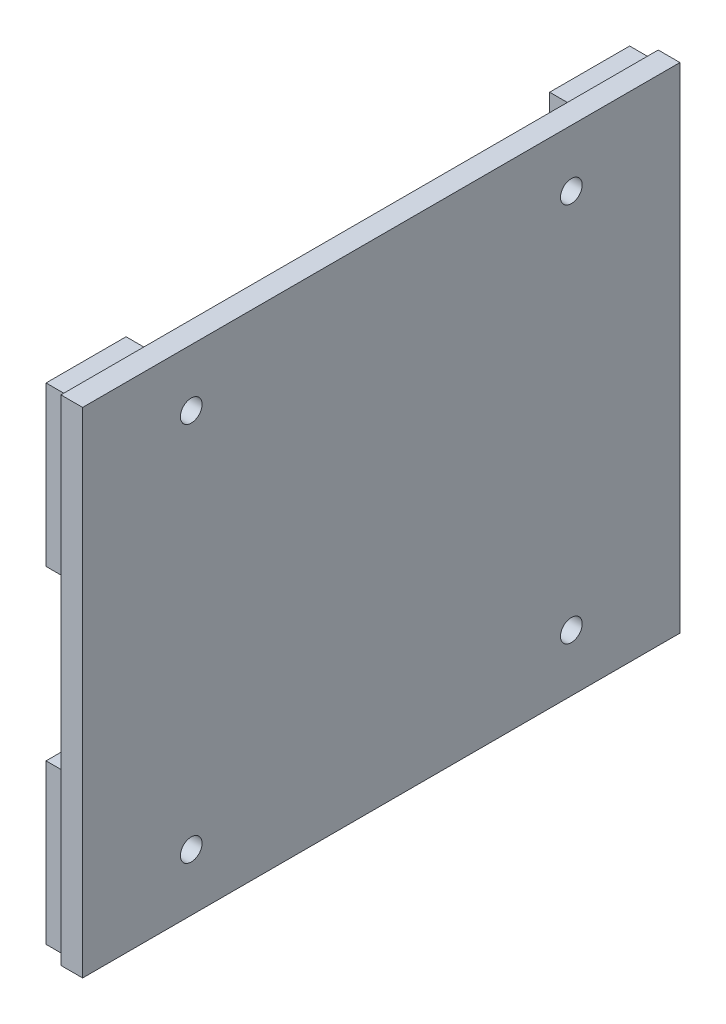
ISO-10303-21;
HEADER;
FILE_DESCRIPTION(('STEP AP214'),'2;1');
FILE_NAME('part.step','',(''),(''),'','','');
FILE_SCHEMA(('AUTOMOTIVE_DESIGN { 1 0 10303 214 1 1 1 1 }'));
ENDSEC;
DATA;
#1=APPLICATION_CONTEXT('core data for automotive mechanical design processes');
#2=APPLICATION_PROTOCOL_DEFINITION('international standard','automotive_design',2000,#1);
#3=PRODUCT_CONTEXT('',#1,'mechanical');
#4=PRODUCT('Part','Part','',(#3));
#5=PRODUCT_RELATED_PRODUCT_CATEGORY('part','',(#4));
#6=PRODUCT_DEFINITION_FORMATION('','',#4);
#7=PRODUCT_DEFINITION_CONTEXT('part definition',#1,'design');
#8=PRODUCT_DEFINITION('design','',#6,#7);
#9=PRODUCT_DEFINITION_SHAPE('','',#8);
#10=(LENGTH_UNIT() NAMED_UNIT(*) SI_UNIT(.MILLI.,.METRE.));
#11=(NAMED_UNIT(*) PLANE_ANGLE_UNIT() SI_UNIT($,.RADIAN.));
#12=(NAMED_UNIT(*) SI_UNIT($,.STERADIAN.) SOLID_ANGLE_UNIT());
#13=UNCERTAINTY_MEASURE_WITH_UNIT(LENGTH_MEASURE(1.E-05),#10,'distance_accuracy_value','');
#14=(GEOMETRIC_REPRESENTATION_CONTEXT(3) GLOBAL_UNCERTAINTY_ASSIGNED_CONTEXT((#13)) GLOBAL_UNIT_ASSIGNED_CONTEXT((#10,
#11,#12)) REPRESENTATION_CONTEXT('',''));
#15=CARTESIAN_POINT('',(0.,0.,0.));
#16=DIRECTION('',(0.,0.,1.));
#17=DIRECTION('',(1.,0.,0.));
#18=AXIS2_PLACEMENT_3D('',#15,#16,#17);
#19=CARTESIAN_POINT('',(0.,0.,0.));
#20=DIRECTION('',(-1.,0.,0.));
#21=DIRECTION('',(0.,0.,1.));
#22=AXIS2_PLACEMENT_3D('',#19,#20,#21);
#23=PLANE('',#22);
#24=CARTESIAN_POINT('',(0.,-55.5625,-55.5625));
#25=DIRECTION('',(1.,0.,0.));
#26=DIRECTION('',(0.,0.,-1.));
#27=AXIS2_PLACEMENT_3D('',#24,#25,#26);
#28=CIRCLE('',#27,3.175);
#29=CARTESIAN_POINT('',(0.,-55.5625,-58.7375));
#30=VERTEX_POINT('',#29);
#31=EDGE_CURVE('E293',#30,#30,#28,.T.);
#32=ORIENTED_EDGE('',*,*,#31,.T.);
#33=EDGE_LOOP('',(#32));
#34=FACE_BOUND('',#33,.T.);
#35=CARTESIAN_POINT('',(0.,55.5625,55.5625));
#36=DIRECTION('',(1.,0.,0.));
#37=DIRECTION('',(0.,0.,-1.));
#38=AXIS2_PLACEMENT_3D('',#35,#36,#37);
#39=CIRCLE('',#38,3.175);
#40=CARTESIAN_POINT('',(0.,55.5625,52.3875));
#41=VERTEX_POINT('',#40);
#42=EDGE_CURVE('E305',#41,#41,#39,.T.);
#43=ORIENTED_EDGE('',*,*,#42,.T.);
#44=EDGE_LOOP('',(#43));
#45=FACE_BOUND('',#44,.T.);
#46=DIRECTION('',(0.,1.,0.));
#47=VECTOR('',#46,1.);
#48=CARTESIAN_POINT('',(0.,-72.23125,-87.3125));
#49=LINE('',#48,#47);
#50=CARTESIAN_POINT('',(0.,-72.23125,-87.3125));
#51=VERTEX_POINT('',#50);
#52=CARTESIAN_POINT('',(0.,72.23125,-87.3125));
#53=VERTEX_POINT('',#52);
#54=EDGE_CURVE('E311',#51,#53,#49,.T.);
#55=ORIENTED_EDGE('',*,*,#54,.F.);
#56=DIRECTION('',(0.,0.,-1.));
#57=VECTOR('',#56,1.);
#58=CARTESIAN_POINT('',(0.,-72.23125,87.3125));
#59=LINE('',#58,#57);
#60=CARTESIAN_POINT('',(0.,-72.23125,87.3125));
#61=VERTEX_POINT('',#60);
#62=EDGE_CURVE('E318',#61,#51,#59,.T.);
#63=ORIENTED_EDGE('',*,*,#62,.F.);
#64=DIRECTION('',(0.,-1.,0.));
#65=VECTOR('',#64,1.);
#66=CARTESIAN_POINT('',(0.,-72.23125,87.3125));
#67=LINE('',#66,#65);
#68=CARTESIAN_POINT('',(0.,72.23125,87.3125));
#69=VERTEX_POINT('',#68);
#70=EDGE_CURVE('E329',#69,#61,#67,.T.);
#71=ORIENTED_EDGE('',*,*,#70,.F.);
#72=DIRECTION('',(0.,0.,1.));
#73=VECTOR('',#72,1.);
#74=CARTESIAN_POINT('',(0.,72.23125,87.3125));
#75=LINE('',#74,#73);
#76=EDGE_CURVE('E327',#53,#69,#75,.T.);
#77=ORIENTED_EDGE('',*,*,#76,.F.);
#78=EDGE_LOOP('',(#55,#63,#71,#77));
#79=FACE_BOUND('',#78,.T.);
#80=CARTESIAN_POINT('',(0.,55.5625,-55.5625));
#81=DIRECTION('',(1.,0.,0.));
#82=DIRECTION('',(0.,0.,-1.));
#83=AXIS2_PLACEMENT_3D('',#80,#81,#82);
#84=CIRCLE('',#83,3.17499999999999);
#85=CARTESIAN_POINT('',(0.,55.5625,-58.7375));
#86=VERTEX_POINT('',#85);
#87=EDGE_CURVE('E299',#86,#86,#84,.T.);
#88=ORIENTED_EDGE('',*,*,#87,.T.);
#89=EDGE_LOOP('',(#88));
#90=FACE_BOUND('',#89,.T.);
#91=CARTESIAN_POINT('',(0.,-55.5625,55.5625));
#92=DIRECTION('',(1.,0.,0.));
#93=DIRECTION('',(0.,0.,-1.));
#94=AXIS2_PLACEMENT_3D('',#91,#92,#93);
#95=CIRCLE('',#94,3.175);
#96=CARTESIAN_POINT('',(0.,-55.5625,52.3875));
#97=VERTEX_POINT('',#96);
#98=EDGE_CURVE('E289',#97,#97,#95,.T.);
#99=ORIENTED_EDGE('',*,*,#98,.T.);
#100=EDGE_LOOP('',(#99));
#101=FACE_BOUND('',#100,.T.);
#102=DIRECTION('',(0.,0.,1.));
#103=VECTOR('',#102,1.);
#104=CARTESIAN_POINT('',(0.,24.60625,85.3069188779781));
#105=LINE('',#104,#103);
#106=CARTESIAN_POINT('',(0.,24.60625,61.9125));
#107=VERTEX_POINT('',#106);
#108=CARTESIAN_POINT('',(0.,24.60625,85.3069188779781));
#109=VERTEX_POINT('',#108);
#110=EDGE_CURVE('E274',#107,#109,#105,.T.);
#111=ORIENTED_EDGE('',*,*,#110,.F.);
#112=DIRECTION('',(0.,-1.,0.));
#113=VECTOR('',#112,1.);
#114=CARTESIAN_POINT('',(0.,71.069393602546,61.9125));
#115=LINE('',#114,#113);
#116=CARTESIAN_POINT('',(0.,71.069393602546,61.9125));
#117=VERTEX_POINT('',#116);
#118=EDGE_CURVE('E260',#117,#107,#115,.T.);
#119=ORIENTED_EDGE('',*,*,#118,.F.);
#120=DIRECTION('',(0.,0.,-1.));
#121=VECTOR('',#120,1.);
#122=CARTESIAN_POINT('',(0.,71.069393602546,61.9125));
#123=LINE('',#122,#121);
#124=CARTESIAN_POINT('',(0.,71.069393602546,85.3069188779781));
#125=VERTEX_POINT('',#124);
#126=EDGE_CURVE('E265',#125,#117,#123,.T.);
#127=ORIENTED_EDGE('',*,*,#126,.F.);
#128=DIRECTION('',(0.,1.,0.));
#129=VECTOR('',#128,1.);
#130=CARTESIAN_POINT('',(0.,24.60625,85.3069188779781));
#131=LINE('',#130,#129);
#132=EDGE_CURVE('E276',#109,#125,#131,.T.);
#133=ORIENTED_EDGE('',*,*,#132,.F.);
#134=EDGE_LOOP('',(#111,#119,#127,#133));
#135=FACE_BOUND('',#134,.T.);
#136=DIRECTION('',(0.,1.,0.));
#137=VECTOR('',#136,1.);
#138=CARTESIAN_POINT('',(0.,71.069393602546,-61.9125));
#139=LINE('',#138,#137);
#140=CARTESIAN_POINT('',(0.,24.60625,-61.9125));
#141=VERTEX_POINT('',#140);
#142=CARTESIAN_POINT('',(0.,71.069393602546,-61.9125));
#143=VERTEX_POINT('',#142);
#144=EDGE_CURVE('E245',#141,#143,#139,.T.);
#145=ORIENTED_EDGE('',*,*,#144,.F.);
#146=DIRECTION('',(0.,0.,1.));
#147=VECTOR('',#146,1.);
#148=CARTESIAN_POINT('',(0.,24.60625,-85.3069188779781));
#149=LINE('',#148,#147);
#150=CARTESIAN_POINT('',(0.,24.60625,-85.3069188779781));
#151=VERTEX_POINT('',#150);
#152=EDGE_CURVE('E231',#151,#141,#149,.T.);
#153=ORIENTED_EDGE('',*,*,#152,.F.);
#154=DIRECTION('',(0.,-1.,0.));
#155=VECTOR('',#154,1.);
#156=CARTESIAN_POINT('',(0.,24.60625,-85.3069188779781));
#157=LINE('',#156,#155);
#158=CARTESIAN_POINT('',(0.,71.069393602546,-85.3069188779781));
#159=VERTEX_POINT('',#158);
#160=EDGE_CURVE('E236',#159,#151,#157,.T.);
#161=ORIENTED_EDGE('',*,*,#160,.F.);
#162=DIRECTION('',(0.,0.,-1.));
#163=VECTOR('',#162,1.);
#164=CARTESIAN_POINT('',(0.,71.069393602546,-61.9125));
#165=LINE('',#164,#163);
#166=EDGE_CURVE('E247',#143,#159,#165,.T.);
#167=ORIENTED_EDGE('',*,*,#166,.F.);
#168=EDGE_LOOP('',(#145,#153,#161,#167));
#169=FACE_BOUND('',#168,.T.);
#170=DIRECTION('',(0.,0.,1.));
#171=VECTOR('',#170,1.);
#172=CARTESIAN_POINT('',(0.,-71.069393602546,-61.9125));
#173=LINE('',#172,#171);
#174=CARTESIAN_POINT('',(0.,-71.069393602546,-85.3069188779781));
#175=VERTEX_POINT('',#174);
#176=CARTESIAN_POINT('',(0.,-71.069393602546,-61.9125));
#177=VERTEX_POINT('',#176);
#178=EDGE_CURVE('E203',#175,#177,#173,.T.);
#179=ORIENTED_EDGE('',*,*,#178,.F.);
#180=DIRECTION('',(0.,-1.,0.));
#181=VECTOR('',#180,1.);
#182=CARTESIAN_POINT('',(0.,-24.60625,-85.3069188779781));
#183=LINE('',#182,#181);
#184=CARTESIAN_POINT('',(0.,-24.60625,-85.3069188779781));
#185=VERTEX_POINT('',#184);
#186=EDGE_CURVE('E200',#185,#175,#183,.T.);
#187=ORIENTED_EDGE('',*,*,#186,.F.);
#188=DIRECTION('',(0.,0.,-1.));
#189=VECTOR('',#188,1.);
#190=CARTESIAN_POINT('',(0.,-24.60625,-85.3069188779781));
#191=LINE('',#190,#189);
#192=CARTESIAN_POINT('',(0.,-24.60625,-61.9125));
#193=VERTEX_POINT('',#192);
#194=EDGE_CURVE('E212',#193,#185,#191,.T.);
#195=ORIENTED_EDGE('',*,*,#194,.F.);
#196=DIRECTION('',(0.,1.,0.));
#197=VECTOR('',#196,1.);
#198=CARTESIAN_POINT('',(0.,-71.069393602546,-61.9125));
#199=LINE('',#198,#197);
#200=EDGE_CURVE('E220',#177,#193,#199,.T.);
#201=ORIENTED_EDGE('',*,*,#200,.F.);
#202=EDGE_LOOP('',(#179,#187,#195,#201));
#203=FACE_BOUND('',#202,.T.);
#204=DIRECTION('',(0.,-1.,0.));
#205=VECTOR('',#204,1.);
#206=CARTESIAN_POINT('',(0.,-71.069393602546,61.9125));
#207=LINE('',#206,#205);
#208=CARTESIAN_POINT('',(0.,-24.60625,61.9125));
#209=VERTEX_POINT('',#208);
#210=CARTESIAN_POINT('',(0.,-71.069393602546,61.9125));
#211=VERTEX_POINT('',#210);
#212=EDGE_CURVE('E647',#209,#211,#207,.T.);
#213=ORIENTED_EDGE('',*,*,#212,.F.);
#214=DIRECTION('',(0.,0.,-1.));
#215=VECTOR('',#214,1.);
#216=CARTESIAN_POINT('',(0.,-24.60625,85.3069188779781));
#217=LINE('',#216,#215);
#218=CARTESIAN_POINT('',(0.,-24.60625,85.3069188779781));
#219=VERTEX_POINT('',#218);
#220=EDGE_CURVE('E198',#219,#209,#217,.T.);
#221=ORIENTED_EDGE('',*,*,#220,.F.);
#222=DIRECTION('',(0.,1.,0.));
#223=VECTOR('',#222,1.);
#224=CARTESIAN_POINT('',(0.,-24.60625,85.3069188779781));
#225=LINE('',#224,#223);
#226=CARTESIAN_POINT('',(0.,-71.069393602546,85.3069188779781));
#227=VERTEX_POINT('',#226);
#228=EDGE_CURVE('E194',#227,#219,#225,.T.);
#229=ORIENTED_EDGE('',*,*,#228,.F.);
#230=DIRECTION('',(0.,0.,1.));
#231=VECTOR('',#230,1.);
#232=CARTESIAN_POINT('',(0.,-71.069393602546,61.9125));
#233=LINE('',#232,#231);
#234=EDGE_CURVE('E644',#211,#227,#233,.T.);
#235=ORIENTED_EDGE('',*,*,#234,.F.);
#236=EDGE_LOOP('',(#213,#221,#229,#235));
#237=FACE_BOUND('',#236,.T.);
#238=ADVANCED_FACE('F37',(#34,#45,#79,#90,#101,#135,#169,#203,#237),#23,.T.);
#239=CARTESIAN_POINT('',(6.35,0.,0.));
#240=DIRECTION('',(-1.,0.,0.));
#241=DIRECTION('',(0.,0.,1.));
#242=AXIS2_PLACEMENT_3D('',#239,#240,#241);
#243=PLANE('',#242);
#244=DIRECTION('',(0.,1.,0.));
#245=VECTOR('',#244,1.);
#246=CARTESIAN_POINT('',(6.35,-72.23125,-87.3125));
#247=LINE('',#246,#245);
#248=CARTESIAN_POINT('',(6.35,-72.23125,-87.3125));
#249=VERTEX_POINT('',#248);
#250=CARTESIAN_POINT('',(6.35,72.23125,-87.3125));
#251=VERTEX_POINT('',#250);
#252=EDGE_CURVE('E314',#249,#251,#247,.T.);
#253=ORIENTED_EDGE('',*,*,#252,.T.);
#254=DIRECTION('',(0.,0.,1.));
#255=VECTOR('',#254,1.);
#256=CARTESIAN_POINT('',(6.35,72.23125,87.3125));
#257=LINE('',#256,#255);
#258=CARTESIAN_POINT('',(6.35,72.23125,87.3125));
#259=VERTEX_POINT('',#258);
#260=EDGE_CURVE('E317',#251,#259,#257,.T.);
#261=ORIENTED_EDGE('',*,*,#260,.T.);
#262=DIRECTION('',(0.,-1.,0.));
#263=VECTOR('',#262,1.);
#264=CARTESIAN_POINT('',(6.35,-72.23125,87.3125));
#265=LINE('',#264,#263);
#266=CARTESIAN_POINT('',(6.35,-72.23125,87.3125));
#267=VERTEX_POINT('',#266);
#268=EDGE_CURVE('E320',#259,#267,#265,.T.);
#269=ORIENTED_EDGE('',*,*,#268,.T.);
#270=DIRECTION('',(0.,0.,-1.));
#271=VECTOR('',#270,1.);
#272=CARTESIAN_POINT('',(6.35,-72.23125,87.3125));
#273=LINE('',#272,#271);
#274=EDGE_CURVE('E322',#267,#249,#273,.T.);
#275=ORIENTED_EDGE('',*,*,#274,.T.);
#276=EDGE_LOOP('',(#253,#261,#269,#275));
#277=FACE_BOUND('',#276,.T.);
#278=CARTESIAN_POINT('',(6.35,55.5625,55.5625));
#279=DIRECTION('',(1.,0.,0.));
#280=DIRECTION('',(0.,0.,-1.));
#281=AXIS2_PLACEMENT_3D('',#278,#279,#280);
#282=CIRCLE('',#281,3.175);
#283=CARTESIAN_POINT('',(6.35,55.5625,52.3875));
#284=VERTEX_POINT('',#283);
#285=EDGE_CURVE('E308',#284,#284,#282,.T.);
#286=ORIENTED_EDGE('',*,*,#285,.F.);
#287=EDGE_LOOP('',(#286));
#288=FACE_BOUND('',#287,.T.);
#289=CARTESIAN_POINT('',(6.35,55.5625,-55.5625));
#290=DIRECTION('',(1.,0.,0.));
#291=DIRECTION('',(0.,0.,-1.));
#292=AXIS2_PLACEMENT_3D('',#289,#290,#291);
#293=CIRCLE('',#292,3.17499999999999);
#294=CARTESIAN_POINT('',(6.35,55.5625,-58.7375));
#295=VERTEX_POINT('',#294);
#296=EDGE_CURVE('E302',#295,#295,#293,.T.);
#297=ORIENTED_EDGE('',*,*,#296,.F.);
#298=EDGE_LOOP('',(#297));
#299=FACE_BOUND('',#298,.T.);
#300=CARTESIAN_POINT('',(6.35,-55.5625,-55.5625));
#301=DIRECTION('',(1.,0.,0.));
#302=DIRECTION('',(0.,0.,-1.));
#303=AXIS2_PLACEMENT_3D('',#300,#301,#302);
#304=CIRCLE('',#303,3.175);
#305=CARTESIAN_POINT('',(6.35,-55.5625,-58.7375));
#306=VERTEX_POINT('',#305);
#307=EDGE_CURVE('E296',#306,#306,#304,.T.);
#308=ORIENTED_EDGE('',*,*,#307,.F.);
#309=EDGE_LOOP('',(#308));
#310=FACE_BOUND('',#309,.T.);
#311=CARTESIAN_POINT('',(6.35,-55.5625,55.5625));
#312=DIRECTION('',(1.,0.,0.));
#313=DIRECTION('',(0.,0.,-1.));
#314=AXIS2_PLACEMENT_3D('',#311,#312,#313);
#315=CIRCLE('',#314,3.175);
#316=CARTESIAN_POINT('',(6.35,-55.5625,52.3875));
#317=VERTEX_POINT('',#316);
#318=EDGE_CURVE('E290',#317,#317,#315,.T.);
#319=ORIENTED_EDGE('',*,*,#318,.F.);
#320=EDGE_LOOP('',(#319));
#321=FACE_BOUND('',#320,.T.);
#322=ADVANCED_FACE('F356',(#277,#288,#299,#310,#321),#243,.F.);
#323=CARTESIAN_POINT('',(6.35,-72.23125,-87.3125));
#324=DIRECTION('',(0.,0.,1.));
#325=DIRECTION('',(1.,0.,0.));
#326=AXIS2_PLACEMENT_3D('',#323,#324,#325);
#327=PLANE('',#326);
#328=ORIENTED_EDGE('',*,*,#54,.T.);
#329=DIRECTION('',(-1.,0.,0.));
#330=VECTOR('',#329,1.);
#331=CARTESIAN_POINT('',(6.35,72.23125,-87.3125));
#332=LINE('',#331,#330);
#333=EDGE_CURVE('E11',#251,#53,#332,.T.);
#334=ORIENTED_EDGE('',*,*,#333,.F.);
#335=ORIENTED_EDGE('',*,*,#252,.F.);
#336=DIRECTION('',(-1.,0.,0.));
#337=VECTOR('',#336,1.);
#338=CARTESIAN_POINT('',(6.35,-72.23125,-87.3125));
#339=LINE('',#338,#337);
#340=EDGE_CURVE('E324',#249,#51,#339,.T.);
#341=ORIENTED_EDGE('',*,*,#340,.T.);
#342=EDGE_LOOP('',(#328,#334,#335,#341));
#343=FACE_BOUND('',#342,.T.);
#344=ADVANCED_FACE('F39',(#343),#327,.F.);
#345=CARTESIAN_POINT('',(6.35,72.23125,87.3125));
#346=DIRECTION('',(0.,-1.,0.));
#347=DIRECTION('',(0.,0.,-1.));
#348=AXIS2_PLACEMENT_3D('',#345,#346,#347);
#349=PLANE('',#348);
#350=ORIENTED_EDGE('',*,*,#76,.T.);
#351=DIRECTION('',(-1.,0.,0.));
#352=VECTOR('',#351,1.);
#353=CARTESIAN_POINT('',(6.35,72.23125,87.3125));
#354=LINE('',#353,#352);
#355=EDGE_CURVE('E45',#259,#69,#354,.T.);
#356=ORIENTED_EDGE('',*,*,#355,.F.);
#357=ORIENTED_EDGE('',*,*,#260,.F.);
#358=ORIENTED_EDGE('',*,*,#333,.T.);
#359=EDGE_LOOP('',(#350,#356,#357,#358));
#360=FACE_BOUND('',#359,.T.);
#361=ADVANCED_FACE('F358',(#360),#349,.F.);
#362=CARTESIAN_POINT('',(6.35,-72.23125,87.3125));
#363=DIRECTION('',(0.,0.,-1.));
#364=DIRECTION('',(-1.,0.,0.));
#365=AXIS2_PLACEMENT_3D('',#362,#363,#364);
#366=PLANE('',#365);
#367=ORIENTED_EDGE('',*,*,#70,.T.);
#368=DIRECTION('',(-1.,0.,0.));
#369=VECTOR('',#368,1.);
#370=CARTESIAN_POINT('',(6.35,-72.23125,87.3125));
#371=LINE('',#370,#369);
#372=EDGE_CURVE('E334',#267,#61,#371,.T.);
#373=ORIENTED_EDGE('',*,*,#372,.F.);
#374=ORIENTED_EDGE('',*,*,#268,.F.);
#375=ORIENTED_EDGE('',*,*,#355,.T.);
#376=EDGE_LOOP('',(#367,#373,#374,#375));
#377=FACE_BOUND('',#376,.T.);
#378=ADVANCED_FACE('F341',(#377),#366,.F.);
#379=CARTESIAN_POINT('',(6.35,-72.23125,87.3125));
#380=DIRECTION('',(0.,1.,0.));
#381=DIRECTION('',(0.,0.,1.));
#382=AXIS2_PLACEMENT_3D('',#379,#380,#381);
#383=PLANE('',#382);
#384=ORIENTED_EDGE('',*,*,#62,.T.);
#385=ORIENTED_EDGE('',*,*,#340,.F.);
#386=ORIENTED_EDGE('',*,*,#274,.F.);
#387=ORIENTED_EDGE('',*,*,#372,.T.);
#388=EDGE_LOOP('',(#384,#385,#386,#387));
#389=FACE_BOUND('',#388,.T.);
#390=ADVANCED_FACE('F350',(#389),#383,.F.);
#391=CARTESIAN_POINT('',(6.35,55.5625,55.5625));
#392=DIRECTION('',(-1.,0.,0.));
#393=DIRECTION('',(0.,0.,1.));
#394=AXIS2_PLACEMENT_3D('',#391,#392,#393);
#395=CYLINDRICAL_SURFACE('',#394,3.175);
#396=ORIENTED_EDGE('',*,*,#285,.T.);
#397=EDGE_LOOP('',(#396));
#398=FACE_BOUND('',#397,.T.);
#399=ORIENTED_EDGE('',*,*,#42,.F.);
#400=EDGE_LOOP('',(#399));
#401=FACE_BOUND('',#400,.T.);
#402=ADVANCED_FACE('F376',(#398,#401),#395,.F.);
#403=CARTESIAN_POINT('',(6.35,55.5625,-55.5625));
#404=DIRECTION('',(-1.,0.,0.));
#405=DIRECTION('',(0.,0.,1.));
#406=AXIS2_PLACEMENT_3D('',#403,#404,#405);
#407=CYLINDRICAL_SURFACE('',#406,3.17499999999999);
#408=ORIENTED_EDGE('',*,*,#296,.T.);
#409=EDGE_LOOP('',(#408));
#410=FACE_BOUND('',#409,.T.);
#411=ORIENTED_EDGE('',*,*,#87,.F.);
#412=EDGE_LOOP('',(#411));
#413=FACE_BOUND('',#412,.T.);
#414=ADVANCED_FACE('F380',(#410,#413),#407,.F.);
#415=CARTESIAN_POINT('',(6.35,-55.5625,-55.5625));
#416=DIRECTION('',(-1.,0.,0.));
#417=DIRECTION('',(0.,0.,1.));
#418=AXIS2_PLACEMENT_3D('',#415,#416,#417);
#419=CYLINDRICAL_SURFACE('',#418,3.175);
#420=ORIENTED_EDGE('',*,*,#307,.T.);
#421=EDGE_LOOP('',(#420));
#422=FACE_BOUND('',#421,.T.);
#423=ORIENTED_EDGE('',*,*,#31,.F.);
#424=EDGE_LOOP('',(#423));
#425=FACE_BOUND('',#424,.T.);
#426=ADVANCED_FACE('F385',(#422,#425),#419,.F.);
#427=CARTESIAN_POINT('',(6.35,-55.5625,55.5625));
#428=DIRECTION('',(-1.,0.,0.));
#429=DIRECTION('',(0.,0.,1.));
#430=AXIS2_PLACEMENT_3D('',#427,#428,#429);
#431=CYLINDRICAL_SURFACE('',#430,3.175);
#432=ORIENTED_EDGE('',*,*,#318,.T.);
#433=EDGE_LOOP('',(#432));
#434=FACE_BOUND('',#433,.T.);
#435=ORIENTED_EDGE('',*,*,#98,.F.);
#436=EDGE_LOOP('',(#435));
#437=FACE_BOUND('',#436,.T.);
#438=ADVANCED_FACE('F392',(#434,#437),#431,.F.);
#439=CARTESIAN_POINT('',(-6.35,71.069393602546,61.9125));
#440=DIRECTION('',(0.,0.,1.));
#441=DIRECTION('',(1.,0.,0.));
#442=AXIS2_PLACEMENT_3D('',#439,#440,#441);
#443=PLANE('',#442);
#444=ORIENTED_EDGE('',*,*,#118,.T.);
#445=DIRECTION('',(1.,0.,0.));
#446=VECTOR('',#445,1.);
#447=CARTESIAN_POINT('',(-6.35,24.60625,61.9125));
#448=LINE('',#447,#446);
#449=CARTESIAN_POINT('',(-6.35,24.60625,61.9125));
#450=VERTEX_POINT('',#449);
#451=EDGE_CURVE('E287',#450,#107,#448,.T.);
#452=ORIENTED_EDGE('',*,*,#451,.F.);
#453=DIRECTION('',(0.,-1.,0.));
#454=VECTOR('',#453,1.);
#455=CARTESIAN_POINT('',(-6.35,71.069393602546,61.9125));
#456=LINE('',#455,#454);
#457=CARTESIAN_POINT('',(-6.35,71.069393602546,61.9125));
#458=VERTEX_POINT('',#457);
#459=EDGE_CURVE('E261',#458,#450,#456,.T.);
#460=ORIENTED_EDGE('',*,*,#459,.F.);
#461=DIRECTION('',(1.,0.,0.));
#462=VECTOR('',#461,1.);
#463=CARTESIAN_POINT('',(-6.35,71.069393602546,61.9125));
#464=LINE('',#463,#462);
#465=EDGE_CURVE('E271',#458,#117,#464,.T.);
#466=ORIENTED_EDGE('',*,*,#465,.T.);
#467=EDGE_LOOP('',(#444,#452,#460,#466));
#468=FACE_BOUND('',#467,.T.);
#469=ADVANCED_FACE('F396',(#468),#443,.F.);
#470=CARTESIAN_POINT('',(-6.35,24.60625,85.3069188779781));
#471=DIRECTION('',(0.,1.,0.));
#472=DIRECTION('',(0.,0.,1.));
#473=AXIS2_PLACEMENT_3D('',#470,#471,#472);
#474=PLANE('',#473);
#475=ORIENTED_EDGE('',*,*,#110,.T.);
#476=DIRECTION('',(1.,0.,0.));
#477=VECTOR('',#476,1.);
#478=CARTESIAN_POINT('',(-6.35,24.60625,85.3069188779781));
#479=LINE('',#478,#477);
#480=CARTESIAN_POINT('',(-6.35,24.60625,85.3069188779781));
#481=VERTEX_POINT('',#480);
#482=EDGE_CURVE('E284',#481,#109,#479,.T.);
#483=ORIENTED_EDGE('',*,*,#482,.F.);
#484=DIRECTION('',(0.,0.,1.));
#485=VECTOR('',#484,1.);
#486=CARTESIAN_POINT('',(-6.35,24.60625,85.3069188779781));
#487=LINE('',#486,#485);
#488=EDGE_CURVE('E264',#450,#481,#487,.T.);
#489=ORIENTED_EDGE('',*,*,#488,.F.);
#490=ORIENTED_EDGE('',*,*,#451,.T.);
#491=EDGE_LOOP('',(#475,#483,#489,#490));
#492=FACE_BOUND('',#491,.T.);
#493=ADVANCED_FACE('F400',(#492),#474,.F.);
#494=CARTESIAN_POINT('',(-6.35,24.60625,85.3069188779781));
#495=DIRECTION('',(0.,0.,-1.));
#496=DIRECTION('',(-1.,0.,0.));
#497=AXIS2_PLACEMENT_3D('',#494,#495,#496);
#498=PLANE('',#497);
#499=ORIENTED_EDGE('',*,*,#132,.T.);
#500=DIRECTION('',(1.,0.,0.));
#501=VECTOR('',#500,1.);
#502=CARTESIAN_POINT('',(-6.35,71.069393602546,85.3069188779781));
#503=LINE('',#502,#501);
#504=CARTESIAN_POINT('',(-6.35,71.069393602546,85.3069188779781));
#505=VERTEX_POINT('',#504);
#506=EDGE_CURVE('E282',#505,#125,#503,.T.);
#507=ORIENTED_EDGE('',*,*,#506,.F.);
#508=DIRECTION('',(0.,1.,0.));
#509=VECTOR('',#508,1.);
#510=CARTESIAN_POINT('',(-6.35,24.60625,85.3069188779781));
#511=LINE('',#510,#509);
#512=EDGE_CURVE('E267',#481,#505,#511,.T.);
#513=ORIENTED_EDGE('',*,*,#512,.F.);
#514=ORIENTED_EDGE('',*,*,#482,.T.);
#515=EDGE_LOOP('',(#499,#507,#513,#514));
#516=FACE_BOUND('',#515,.T.);
#517=ADVANCED_FACE('F404',(#516),#498,.F.);
#518=CARTESIAN_POINT('',(-6.35,71.069393602546,61.9125));
#519=DIRECTION('',(0.,-1.,0.));
#520=DIRECTION('',(0.,0.,-1.));
#521=AXIS2_PLACEMENT_3D('',#518,#519,#520);
#522=PLANE('',#521);
#523=ORIENTED_EDGE('',*,*,#126,.T.);
#524=ORIENTED_EDGE('',*,*,#465,.F.);
#525=DIRECTION('',(0.,0.,-1.));
#526=VECTOR('',#525,1.);
#527=CARTESIAN_POINT('',(-6.35,71.069393602546,61.9125));
#528=LINE('',#527,#526);
#529=EDGE_CURVE('E269',#505,#458,#528,.T.);
#530=ORIENTED_EDGE('',*,*,#529,.F.);
#531=ORIENTED_EDGE('',*,*,#506,.T.);
#532=EDGE_LOOP('',(#523,#524,#530,#531));
#533=FACE_BOUND('',#532,.T.);
#534=ADVANCED_FACE('F408',(#533),#522,.F.);
#535=CARTESIAN_POINT('',(-6.35,0.,0.));
#536=DIRECTION('',(1.,0.,0.));
#537=DIRECTION('',(0.,0.,-1.));
#538=AXIS2_PLACEMENT_3D('',#535,#536,#537);
#539=PLANE('',#538);
#540=ORIENTED_EDGE('',*,*,#459,.T.);
#541=ORIENTED_EDGE('',*,*,#488,.T.);
#542=ORIENTED_EDGE('',*,*,#512,.T.);
#543=ORIENTED_EDGE('',*,*,#529,.T.);
#544=EDGE_LOOP('',(#540,#541,#542,#543));
#545=FACE_BOUND('',#544,.T.);
#546=ADVANCED_FACE('F412',(#545),#539,.F.);
#547=CARTESIAN_POINT('',(-6.35,24.60625,-85.3069188779781));
#548=DIRECTION('',(0.,1.,0.));
#549=DIRECTION('',(0.,0.,1.));
#550=AXIS2_PLACEMENT_3D('',#547,#548,#549);
#551=PLANE('',#550);
#552=ORIENTED_EDGE('',*,*,#152,.T.);
#553=DIRECTION('',(1.,0.,0.));
#554=VECTOR('',#553,1.);
#555=CARTESIAN_POINT('',(-6.35,24.60625,-61.9125));
#556=LINE('',#555,#554);
#557=CARTESIAN_POINT('',(-6.35,24.60625,-61.9125));
#558=VERTEX_POINT('',#557);
#559=EDGE_CURVE('E258',#558,#141,#556,.T.);
#560=ORIENTED_EDGE('',*,*,#559,.F.);
#561=DIRECTION('',(0.,0.,1.));
#562=VECTOR('',#561,1.);
#563=CARTESIAN_POINT('',(-6.35,24.60625,-85.3069188779781));
#564=LINE('',#563,#562);
#565=CARTESIAN_POINT('',(-6.35,24.60625,-85.3069188779781));
#566=VERTEX_POINT('',#565);
#567=EDGE_CURVE('E232',#566,#558,#564,.T.);
#568=ORIENTED_EDGE('',*,*,#567,.F.);
#569=DIRECTION('',(1.,0.,0.));
#570=VECTOR('',#569,1.);
#571=CARTESIAN_POINT('',(-6.35,24.60625,-85.3069188779781));
#572=LINE('',#571,#570);
#573=EDGE_CURVE('E242',#566,#151,#572,.T.);
#574=ORIENTED_EDGE('',*,*,#573,.T.);
#575=EDGE_LOOP('',(#552,#560,#568,#574));
#576=FACE_BOUND('',#575,.T.);
#577=ADVANCED_FACE('F416',(#576),#551,.F.);
#578=CARTESIAN_POINT('',(-6.35,71.069393602546,-61.9125));
#579=DIRECTION('',(0.,0.,-1.));
#580=DIRECTION('',(-1.,0.,0.));
#581=AXIS2_PLACEMENT_3D('',#578,#579,#580);
#582=PLANE('',#581);
#583=ORIENTED_EDGE('',*,*,#144,.T.);
#584=DIRECTION('',(1.,0.,0.));
#585=VECTOR('',#584,1.);
#586=CARTESIAN_POINT('',(-6.35,71.069393602546,-61.9125));
#587=LINE('',#586,#585);
#588=CARTESIAN_POINT('',(-6.35,71.069393602546,-61.9125));
#589=VERTEX_POINT('',#588);
#590=EDGE_CURVE('E255',#589,#143,#587,.T.);
#591=ORIENTED_EDGE('',*,*,#590,.F.);
#592=DIRECTION('',(0.,1.,0.));
#593=VECTOR('',#592,1.);
#594=CARTESIAN_POINT('',(-6.35,71.069393602546,-61.9125));
#595=LINE('',#594,#593);
#596=EDGE_CURVE('E235',#558,#589,#595,.T.);
#597=ORIENTED_EDGE('',*,*,#596,.F.);
#598=ORIENTED_EDGE('',*,*,#559,.T.);
#599=EDGE_LOOP('',(#583,#591,#597,#598));
#600=FACE_BOUND('',#599,.T.);
#601=ADVANCED_FACE('F420',(#600),#582,.F.);
#602=CARTESIAN_POINT('',(-6.35,71.069393602546,-61.9125));
#603=DIRECTION('',(0.,-1.,0.));
#604=DIRECTION('',(0.,0.,-1.));
#605=AXIS2_PLACEMENT_3D('',#602,#603,#604);
#606=PLANE('',#605);
#607=ORIENTED_EDGE('',*,*,#166,.T.);
#608=DIRECTION('',(1.,0.,0.));
#609=VECTOR('',#608,1.);
#610=CARTESIAN_POINT('',(-6.35,71.069393602546,-85.3069188779781));
#611=LINE('',#610,#609);
#612=CARTESIAN_POINT('',(-6.35,71.069393602546,-85.3069188779781));
#613=VERTEX_POINT('',#612);
#614=EDGE_CURVE('E253',#613,#159,#611,.T.);
#615=ORIENTED_EDGE('',*,*,#614,.F.);
#616=DIRECTION('',(0.,0.,-1.));
#617=VECTOR('',#616,1.);
#618=CARTESIAN_POINT('',(-6.35,71.069393602546,-61.9125));
#619=LINE('',#618,#617);
#620=EDGE_CURVE('E238',#589,#613,#619,.T.);
#621=ORIENTED_EDGE('',*,*,#620,.F.);
#622=ORIENTED_EDGE('',*,*,#590,.T.);
#623=EDGE_LOOP('',(#607,#615,#621,#622));
#624=FACE_BOUND('',#623,.T.);
#625=ADVANCED_FACE('F424',(#624),#606,.F.);
#626=CARTESIAN_POINT('',(-6.35,24.60625,-85.3069188779781));
#627=DIRECTION('',(0.,0.,1.));
#628=DIRECTION('',(1.,0.,0.));
#629=AXIS2_PLACEMENT_3D('',#626,#627,#628);
#630=PLANE('',#629);
#631=ORIENTED_EDGE('',*,*,#160,.T.);
#632=ORIENTED_EDGE('',*,*,#573,.F.);
#633=DIRECTION('',(0.,-1.,0.));
#634=VECTOR('',#633,1.);
#635=CARTESIAN_POINT('',(-6.35,24.60625,-85.3069188779781));
#636=LINE('',#635,#634);
#637=EDGE_CURVE('E240',#613,#566,#636,.T.);
#638=ORIENTED_EDGE('',*,*,#637,.F.);
#639=ORIENTED_EDGE('',*,*,#614,.T.);
#640=EDGE_LOOP('',(#631,#632,#638,#639));
#641=FACE_BOUND('',#640,.T.);
#642=ADVANCED_FACE('F428',(#641),#630,.F.);
#643=CARTESIAN_POINT('',(-6.35,0.,0.));
#644=DIRECTION('',(1.,0.,0.));
#645=DIRECTION('',(0.,0.,-1.));
#646=AXIS2_PLACEMENT_3D('',#643,#644,#645);
#647=PLANE('',#646);
#648=ORIENTED_EDGE('',*,*,#567,.T.);
#649=ORIENTED_EDGE('',*,*,#596,.T.);
#650=ORIENTED_EDGE('',*,*,#620,.T.);
#651=ORIENTED_EDGE('',*,*,#637,.T.);
#652=EDGE_LOOP('',(#648,#649,#650,#651));
#653=FACE_BOUND('',#652,.T.);
#654=ADVANCED_FACE('F432',(#653),#647,.F.);
#655=CARTESIAN_POINT('',(-6.35,-24.60625,-85.3069188779781));
#656=DIRECTION('',(0.,0.,1.));
#657=DIRECTION('',(1.,0.,0.));
#658=AXIS2_PLACEMENT_3D('',#655,#656,#657);
#659=PLANE('',#658);
#660=ORIENTED_EDGE('',*,*,#186,.T.);
#661=DIRECTION('',(1.,0.,0.));
#662=VECTOR('',#661,1.);
#663=CARTESIAN_POINT('',(-6.35,-71.069393602546,-85.3069188779781));
#664=LINE('',#663,#662);
#665=CARTESIAN_POINT('',(-6.35,-71.069393602546,-85.3069188779781));
#666=VERTEX_POINT('',#665);
#667=EDGE_CURVE('E229',#666,#175,#664,.T.);
#668=ORIENTED_EDGE('',*,*,#667,.F.);
#669=DIRECTION('',(0.,-1.,0.));
#670=VECTOR('',#669,1.);
#671=CARTESIAN_POINT('',(-6.35,-24.60625,-85.3069188779781));
#672=LINE('',#671,#670);
#673=CARTESIAN_POINT('',(-6.35,-24.60625,-85.3069188779781));
#674=VERTEX_POINT('',#673);
#675=EDGE_CURVE('E208',#674,#666,#672,.T.);
#676=ORIENTED_EDGE('',*,*,#675,.F.);
#677=DIRECTION('',(1.,0.,0.));
#678=VECTOR('',#677,1.);
#679=CARTESIAN_POINT('',(-6.35,-24.60625,-85.3069188779781));
#680=LINE('',#679,#678);
#681=EDGE_CURVE('E217',#674,#185,#680,.T.);
#682=ORIENTED_EDGE('',*,*,#681,.T.);
#683=EDGE_LOOP('',(#660,#668,#676,#682));
#684=FACE_BOUND('',#683,.T.);
#685=ADVANCED_FACE('F436',(#684),#659,.F.);
#686=CARTESIAN_POINT('',(-6.35,-71.069393602546,-61.9125));
#687=DIRECTION('',(0.,1.,0.));
#688=DIRECTION('',(0.,0.,1.));
#689=AXIS2_PLACEMENT_3D('',#686,#687,#688);
#690=PLANE('',#689);
#691=ORIENTED_EDGE('',*,*,#178,.T.);
#692=DIRECTION('',(1.,0.,0.));
#693=VECTOR('',#692,1.);
#694=CARTESIAN_POINT('',(-6.35,-71.069393602546,-61.9125));
#695=LINE('',#694,#693);
#696=CARTESIAN_POINT('',(-6.35,-71.069393602546,-61.9125));
#697=VERTEX_POINT('',#696);
#698=EDGE_CURVE('E226',#697,#177,#695,.T.);
#699=ORIENTED_EDGE('',*,*,#698,.F.);
#700=DIRECTION('',(0.,0.,1.));
#701=VECTOR('',#700,1.);
#702=CARTESIAN_POINT('',(-6.35,-71.069393602546,-61.9125));
#703=LINE('',#702,#701);
#704=EDGE_CURVE('E211',#666,#697,#703,.T.);
#705=ORIENTED_EDGE('',*,*,#704,.F.);
#706=ORIENTED_EDGE('',*,*,#667,.T.);
#707=EDGE_LOOP('',(#691,#699,#705,#706));
#708=FACE_BOUND('',#707,.T.);
#709=ADVANCED_FACE('F440',(#708),#690,.F.);
#710=CARTESIAN_POINT('',(-6.35,-71.069393602546,-61.9125));
#711=DIRECTION('',(0.,0.,-1.));
#712=DIRECTION('',(-1.,0.,0.));
#713=AXIS2_PLACEMENT_3D('',#710,#711,#712);
#714=PLANE('',#713);
#715=ORIENTED_EDGE('',*,*,#200,.T.);
#716=DIRECTION('',(1.,0.,0.));
#717=VECTOR('',#716,1.);
#718=CARTESIAN_POINT('',(-6.35,-24.60625,-61.9125));
#719=LINE('',#718,#717);
#720=CARTESIAN_POINT('',(-6.35,-24.60625,-61.9125));
#721=VERTEX_POINT('',#720);
#722=EDGE_CURVE('E60',#721,#193,#719,.T.);
#723=ORIENTED_EDGE('',*,*,#722,.F.);
#724=DIRECTION('',(0.,1.,0.));
#725=VECTOR('',#724,1.);
#726=CARTESIAN_POINT('',(-6.35,-71.069393602546,-61.9125));
#727=LINE('',#726,#725);
#728=EDGE_CURVE('E214',#697,#721,#727,.T.);
#729=ORIENTED_EDGE('',*,*,#728,.F.);
#730=ORIENTED_EDGE('',*,*,#698,.T.);
#731=EDGE_LOOP('',(#715,#723,#729,#730));
#732=FACE_BOUND('',#731,.T.);
#733=ADVANCED_FACE('F444',(#732),#714,.F.);
#734=CARTESIAN_POINT('',(-6.35,-24.60625,-85.3069188779781));
#735=DIRECTION('',(0.,-1.,0.));
#736=DIRECTION('',(0.,0.,-1.));
#737=AXIS2_PLACEMENT_3D('',#734,#735,#736);
#738=PLANE('',#737);
#739=ORIENTED_EDGE('',*,*,#194,.T.);
#740=ORIENTED_EDGE('',*,*,#681,.F.);
#741=DIRECTION('',(0.,0.,-1.));
#742=VECTOR('',#741,1.);
#743=CARTESIAN_POINT('',(-6.35,-24.60625,-85.3069188779781));
#744=LINE('',#743,#742);
#745=EDGE_CURVE('E216',#721,#674,#744,.T.);
#746=ORIENTED_EDGE('',*,*,#745,.F.);
#747=ORIENTED_EDGE('',*,*,#722,.T.);
#748=EDGE_LOOP('',(#739,#740,#746,#747));
#749=FACE_BOUND('',#748,.T.);
#750=ADVANCED_FACE('F448',(#749),#738,.F.);
#751=CARTESIAN_POINT('',(-6.35,0.,0.));
#752=DIRECTION('',(1.,0.,0.));
#753=DIRECTION('',(0.,0.,-1.));
#754=AXIS2_PLACEMENT_3D('',#751,#752,#753);
#755=PLANE('',#754);
#756=ORIENTED_EDGE('',*,*,#675,.T.);
#757=ORIENTED_EDGE('',*,*,#704,.T.);
#758=ORIENTED_EDGE('',*,*,#728,.T.);
#759=ORIENTED_EDGE('',*,*,#745,.T.);
#760=EDGE_LOOP('',(#756,#757,#758,#759));
#761=FACE_BOUND('',#760,.T.);
#762=ADVANCED_FACE('F452',(#761),#755,.F.);
#763=CARTESIAN_POINT('',(-6.35,-24.60625,85.3069188779781));
#764=DIRECTION('',(0.,-1.,0.));
#765=DIRECTION('',(0.,0.,-1.));
#766=AXIS2_PLACEMENT_3D('',#763,#764,#765);
#767=PLANE('',#766);
#768=ORIENTED_EDGE('',*,*,#220,.T.);
#769=DIRECTION('',(1.,0.,0.));
#770=VECTOR('',#769,1.);
#771=CARTESIAN_POINT('',(-6.35,-24.60625,61.9125));
#772=LINE('',#771,#770);
#773=CARTESIAN_POINT('',(-6.35,-24.60625,61.9125));
#774=VERTEX_POINT('',#773);
#775=EDGE_CURVE('E179',#774,#209,#772,.T.);
#776=ORIENTED_EDGE('',*,*,#775,.F.);
#777=DIRECTION('',(0.,0.,-1.));
#778=VECTOR('',#777,1.);
#779=CARTESIAN_POINT('',(-6.35,-24.60625,85.3069188779781));
#780=LINE('',#779,#778);
#781=CARTESIAN_POINT('',(-6.35,-24.60625,85.3069188779781));
#782=VERTEX_POINT('',#781);
#783=EDGE_CURVE('E186',#782,#774,#780,.T.);
#784=ORIENTED_EDGE('',*,*,#783,.F.);
#785=DIRECTION('',(1.,0.,0.));
#786=VECTOR('',#785,1.);
#787=CARTESIAN_POINT('',(-6.35,-24.60625,85.3069188779781));
#788=LINE('',#787,#786);
#789=EDGE_CURVE('E641',#782,#219,#788,.T.);
#790=ORIENTED_EDGE('',*,*,#789,.T.);
#791=EDGE_LOOP('',(#768,#776,#784,#790));
#792=FACE_BOUND('',#791,.T.);
#793=ADVANCED_FACE('F196',(#792),#767,.F.);
#794=CARTESIAN_POINT('',(-6.35,-71.069393602546,61.9125));
#795=DIRECTION('',(0.,0.,1.));
#796=DIRECTION('',(1.,0.,0.));
#797=AXIS2_PLACEMENT_3D('',#794,#795,#796);
#798=PLANE('',#797);
#799=ORIENTED_EDGE('',*,*,#212,.T.);
#800=DIRECTION('',(1.,0.,0.));
#801=VECTOR('',#800,1.);
#802=CARTESIAN_POINT('',(-6.35,-71.069393602546,61.9125));
#803=LINE('',#802,#801);
#804=CARTESIAN_POINT('',(-6.35,-71.069393602546,61.9125));
#805=VERTEX_POINT('',#804);
#806=EDGE_CURVE('E182',#805,#211,#803,.T.);
#807=ORIENTED_EDGE('',*,*,#806,.F.);
#808=DIRECTION('',(0.,-1.,0.));
#809=VECTOR('',#808,1.);
#810=CARTESIAN_POINT('',(-6.35,-71.069393602546,61.9125));
#811=LINE('',#810,#809);
#812=EDGE_CURVE('E175',#774,#805,#811,.T.);
#813=ORIENTED_EDGE('',*,*,#812,.F.);
#814=ORIENTED_EDGE('',*,*,#775,.T.);
#815=EDGE_LOOP('',(#799,#807,#813,#814));
#816=FACE_BOUND('',#815,.T.);
#817=ADVANCED_FACE('F177',(#816),#798,.F.);
#818=CARTESIAN_POINT('',(-6.35,-71.069393602546,61.9125));
#819=DIRECTION('',(0.,1.,0.));
#820=DIRECTION('',(0.,0.,1.));
#821=AXIS2_PLACEMENT_3D('',#818,#819,#820);
#822=PLANE('',#821);
#823=ORIENTED_EDGE('',*,*,#234,.T.);
#824=DIRECTION('',(1.,0.,0.));
#825=VECTOR('',#824,1.);
#826=CARTESIAN_POINT('',(-6.35,-71.069393602546,85.3069188779781));
#827=LINE('',#826,#825);
#828=CARTESIAN_POINT('',(-6.35,-71.069393602546,85.3069188779781));
#829=VERTEX_POINT('',#828);
#830=EDGE_CURVE('E52',#829,#227,#827,.T.);
#831=ORIENTED_EDGE('',*,*,#830,.F.);
#832=DIRECTION('',(0.,0.,1.));
#833=VECTOR('',#832,1.);
#834=CARTESIAN_POINT('',(-6.35,-71.069393602546,61.9125));
#835=LINE('',#834,#833);
#836=EDGE_CURVE('E185',#805,#829,#835,.T.);
#837=ORIENTED_EDGE('',*,*,#836,.F.);
#838=ORIENTED_EDGE('',*,*,#806,.T.);
#839=EDGE_LOOP('',(#823,#831,#837,#838));
#840=FACE_BOUND('',#839,.T.);
#841=ADVANCED_FACE('F460',(#840),#822,.F.);
#842=CARTESIAN_POINT('',(-6.35,-24.60625,85.3069188779781));
#843=DIRECTION('',(0.,0.,-1.));
#844=DIRECTION('',(-1.,0.,0.));
#845=AXIS2_PLACEMENT_3D('',#842,#843,#844);
#846=PLANE('',#845);
#847=ORIENTED_EDGE('',*,*,#228,.T.);
#848=ORIENTED_EDGE('',*,*,#789,.F.);
#849=DIRECTION('',(0.,1.,0.));
#850=VECTOR('',#849,1.);
#851=CARTESIAN_POINT('',(-6.35,-24.60625,85.3069188779781));
#852=LINE('',#851,#850);
#853=EDGE_CURVE('E190',#829,#782,#852,.T.);
#854=ORIENTED_EDGE('',*,*,#853,.F.);
#855=ORIENTED_EDGE('',*,*,#830,.T.);
#856=EDGE_LOOP('',(#847,#848,#854,#855));
#857=FACE_BOUND('',#856,.T.);
#858=ADVANCED_FACE('F463',(#857),#846,.F.);
#859=CARTESIAN_POINT('',(-6.35,0.,0.));
#860=DIRECTION('',(1.,0.,0.));
#861=DIRECTION('',(0.,0.,-1.));
#862=AXIS2_PLACEMENT_3D('',#859,#860,#861);
#863=PLANE('',#862);
#864=ORIENTED_EDGE('',*,*,#783,.T.);
#865=ORIENTED_EDGE('',*,*,#812,.T.);
#866=ORIENTED_EDGE('',*,*,#836,.T.);
#867=ORIENTED_EDGE('',*,*,#853,.T.);
#868=EDGE_LOOP('',(#864,#865,#866,#867));
#869=FACE_BOUND('',#868,.T.);
#870=ADVANCED_FACE('F189',(#869),#863,.F.);
#871=CLOSED_SHELL('',(#238,#322,#344,#361,#378,#390,#402,#414,#426,#438,#469,#493,#517,#534,
#546,#577,#601,#625,#642,#654,#685,#709,#733,#750,#762,#793,#817,#841,#858,#870));
#872=MANIFOLD_SOLID_BREP('B2',#871);
#873=ADVANCED_BREP_SHAPE_REPRESENTATION('',(#18,#872),#14);
#874=SHAPE_DEFINITION_REPRESENTATION(#9,#873);
ENDSEC;
END-ISO-10303-21;
